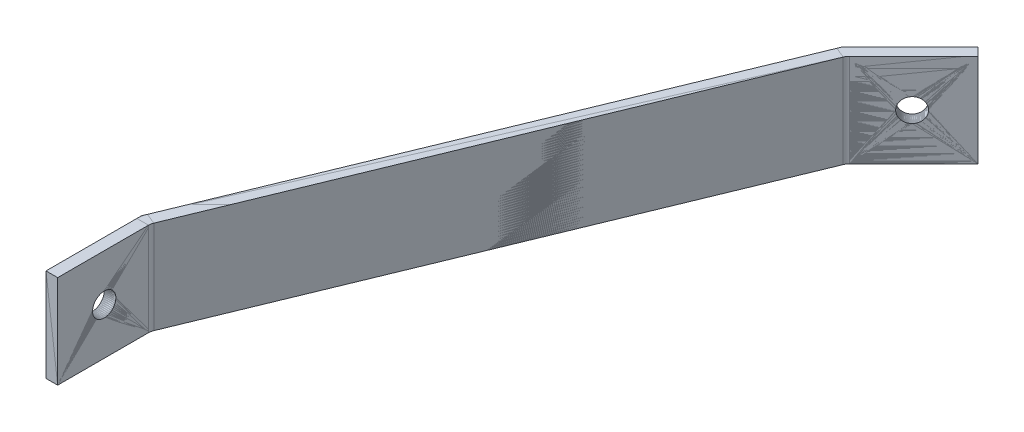
ISO-10303-21;
HEADER;
FILE_DESCRIPTION(('STEP AP214'),'2;1');
FILE_NAME('part.step','',(''),(''),'','','');
FILE_SCHEMA(('AUTOMOTIVE_DESIGN { 1 0 10303 214 1 1 1 1 }'));
ENDSEC;
DATA;
#1=APPLICATION_CONTEXT('core data for automotive mechanical design processes');
#2=APPLICATION_PROTOCOL_DEFINITION('international standard','automotive_design',2000,#1);
#3=PRODUCT_CONTEXT('',#1,'mechanical');
#4=PRODUCT('Part','Part','',(#3));
#5=PRODUCT_RELATED_PRODUCT_CATEGORY('part','',(#4));
#6=PRODUCT_DEFINITION_FORMATION('','',#4);
#7=PRODUCT_DEFINITION_CONTEXT('part definition',#1,'design');
#8=PRODUCT_DEFINITION('design','',#6,#7);
#9=PRODUCT_DEFINITION_SHAPE('','',#8);
#10=(LENGTH_UNIT() NAMED_UNIT(*) SI_UNIT(.MILLI.,.METRE.));
#11=(NAMED_UNIT(*) PLANE_ANGLE_UNIT() SI_UNIT($,.RADIAN.));
#12=(NAMED_UNIT(*) SI_UNIT($,.STERADIAN.) SOLID_ANGLE_UNIT());
#13=UNCERTAINTY_MEASURE_WITH_UNIT(LENGTH_MEASURE(1.E-05),#10,'distance_accuracy_value','');
#14=(GEOMETRIC_REPRESENTATION_CONTEXT(3) GLOBAL_UNCERTAINTY_ASSIGNED_CONTEXT((#13)) GLOBAL_UNIT_ASSIGNED_CONTEXT((#10,
#11,#12)) REPRESENTATION_CONTEXT('',''));
#15=CARTESIAN_POINT('',(0.,0.,0.));
#16=DIRECTION('',(0.,0.,1.));
#17=DIRECTION('',(1.,0.,0.));
#18=AXIS2_PLACEMENT_3D('',#15,#16,#17);
#19=CARTESIAN_POINT('',(63.6166951055954,851.804423501954,208.813328987844));
#20=DIRECTION('',(0.,1.,0.));
#21=DIRECTION('',(-0.380312673817329,0.,0.924857972952558));
#22=AXIS2_PLACEMENT_3D('',#19,#20,#21);
#23=PLANE('',#22);
#24=DIRECTION('',(0.924857972952558,0.,0.380312673817329));
#25=VECTOR('',#24,1.);
#26=CARTESIAN_POINT('',(8.60500466205431,851.804423501954,342.592726875448));
#27=LINE('',#26,#25);
#28=CARTESIAN_POINT('',(5.66858059792995,851.804423501954,341.385234136078));
#29=VERTEX_POINT('',#28);
#30=CARTESIAN_POINT('',(8.60500466205431,851.804423501954,342.592726875448));
#31=VERTEX_POINT('',#30);
#32=EDGE_CURVE('E12',#29,#31,#27,.T.);
#33=ORIENTED_EDGE('',*,*,#32,.F.);
#34=DIRECTION('',(0.380312673817329,0.,-0.924857972952558));
#35=VECTOR('',#34,1.);
#36=CARTESIAN_POINT('',(60.6802710414711,851.804423501954,207.605836248474));
#37=LINE('',#36,#35);
#38=CARTESIAN_POINT('',(60.4384756773761,851.804423501954,208.193842869609));
#39=VERTEX_POINT('',#38);
#40=EDGE_CURVE('E113',#39,#29,#37,.F.);
#41=ORIENTED_EDGE('',*,*,#40,.F.);
#42=DIRECTION('',(0.924857972952558,0.,0.380312673817328));
#43=VECTOR('',#42,1.);
#44=CARTESIAN_POINT('',(63.3748997415005,851.804423501954,209.40133560898));
#45=LINE('',#44,#43);
#46=CARTESIAN_POINT('',(63.3748997415005,851.804423501954,209.40133560898));
#47=VERTEX_POINT('',#46);
#48=EDGE_CURVE('E66',#39,#47,#45,.T.);
#49=ORIENTED_EDGE('',*,*,#48,.T.);
#50=DIRECTION('',(-0.380312673817329,0.,0.924857972952558));
#51=VECTOR('',#50,1.);
#52=CARTESIAN_POINT('',(63.6166951055954,851.804423501954,208.813328987844));
#53=LINE('',#52,#51);
#54=EDGE_CURVE('E115',#47,#31,#53,.T.);
#55=ORIENTED_EDGE('',*,*,#54,.T.);
#56=EDGE_LOOP('',(#33,#41,#49,#55));
#57=FACE_BOUND('',#56,.T.);
#58=ADVANCED_FACE('F55',(#57),#23,.F.);
#59=CARTESIAN_POINT('',(66.3113238056248,851.804423501954,210.60882834835));
#60=DIRECTION('',(0.,-1.,0.));
#61=DIRECTION('',(0.,0.,-1.));
#62=AXIS2_PLACEMENT_3D('',#59,#60,#61);
#63=PLANE('',#62);
#64=ORIENTED_EDGE('',*,*,#48,.F.);
#65=CARTESIAN_POINT('',(66.3113238056248,851.804423501954,210.60882834835));
#66=DIRECTION('',(0.,1.,0.));
#67=DIRECTION('',(0.,0.,1.));
#68=AXIS2_PLACEMENT_3D('',#65,#66,#67);
#69=CIRCLE('',#68,6.35);
#70=CARTESIAN_POINT('',(61.8211957450903,851.804423501954,206.118700287815));
#71=VERTEX_POINT('',#70);
#72=EDGE_CURVE('E160',#39,#71,#69,.F.);
#73=ORIENTED_EDGE('',*,*,#72,.T.);
#74=DIRECTION('',(0.707106781186548,0.,0.707106781186547));
#75=VECTOR('',#74,1.);
#76=CARTESIAN_POINT('',(64.0662597753575,851.804423501954,208.363764318082));
#77=LINE('',#76,#75);
#78=CARTESIAN_POINT('',(64.0662597753575,851.804423501954,208.363764318082));
#79=VERTEX_POINT('',#78);
#80=EDGE_CURVE('E199',#71,#79,#77,.T.);
#81=ORIENTED_EDGE('',*,*,#80,.T.);
#82=CARTESIAN_POINT('',(66.3113238056248,851.804423501954,210.60882834835));
#83=DIRECTION('',(0.,1.,0.));
#84=DIRECTION('',(0.,0.,1.));
#85=AXIS2_PLACEMENT_3D('',#82,#83,#84);
#86=CIRCLE('',#85,3.175);
#87=EDGE_CURVE('E269',#47,#79,#86,.F.);
#88=ORIENTED_EDGE('',*,*,#87,.F.);
#89=EDGE_LOOP('',(#64,#73,#81,#88));
#90=FACE_BOUND('',#89,.T.);
#91=ADVANCED_FACE('F314',(#90),#63,.T.);
#92=CARTESIAN_POINT('',(81.5772073477337,851.804423501954,190.852816745706));
#93=DIRECTION('',(0.,1.,0.));
#94=DIRECTION('',(-0.707106781186547,0.,0.707106781186548));
#95=AXIS2_PLACEMENT_3D('',#92,#93,#94);
#96=PLANE('',#95);
#97=ORIENTED_EDGE('',*,*,#80,.F.);
#98=DIRECTION('',(0.707106781186547,0.,-0.707106781186548));
#99=VECTOR('',#98,1.);
#100=CARTESIAN_POINT('',(79.3321433174664,851.804423501954,188.607752715439));
#101=LINE('',#100,#99);
#102=CARTESIAN_POINT('',(79.3321433174664,851.804423501954,188.607752715439));
#103=VERTEX_POINT('',#102);
#104=EDGE_CURVE('E167',#103,#71,#101,.F.);
#105=ORIENTED_EDGE('',*,*,#104,.F.);
#106=DIRECTION('',(0.707106781186548,0.,0.707106781186547));
#107=VECTOR('',#106,1.);
#108=CARTESIAN_POINT('',(81.5772073477337,851.804423501954,190.852816745706));
#109=LINE('',#108,#107);
#110=CARTESIAN_POINT('',(81.5772073477337,851.804423501954,190.852816745706));
#111=VERTEX_POINT('',#110);
#112=EDGE_CURVE('E195',#103,#111,#109,.T.);
#113=ORIENTED_EDGE('',*,*,#112,.T.);
#114=DIRECTION('',(-0.707106781186547,0.,0.707106781186548));
#115=VECTOR('',#114,1.);
#116=CARTESIAN_POINT('',(81.5772073477337,851.804423501954,190.852816745706));
#117=LINE('',#116,#115);
#118=EDGE_CURVE('E250',#111,#79,#117,.T.);
#119=ORIENTED_EDGE('',*,*,#118,.T.);
#120=EDGE_LOOP('',(#97,#105,#113,#119));
#121=FACE_BOUND('',#120,.T.);
#122=ADVANCED_FACE('F330',(#121),#96,.F.);
#123=CARTESIAN_POINT('',(81.5772073477337,877.204423501954,190.852816745706));
#124=DIRECTION('',(-0.707106781186547,0.,0.707106781186548));
#125=DIRECTION('',(0.,-1.,0.));
#126=AXIS2_PLACEMENT_3D('',#123,#124,#125);
#127=PLANE('',#126);
#128=ORIENTED_EDGE('',*,*,#112,.F.);
#129=DIRECTION('',(0.,1.,0.));
#130=VECTOR('',#129,1.);
#131=CARTESIAN_POINT('',(79.3321433174664,877.204423501954,188.607752715439));
#132=LINE('',#131,#130);
#133=CARTESIAN_POINT('',(79.3321433174664,877.204423501954,188.607752715439));
#134=VERTEX_POINT('',#133);
#135=EDGE_CURVE('E301',#134,#103,#132,.F.);
#136=ORIENTED_EDGE('',*,*,#135,.F.);
#137=DIRECTION('',(0.707106781186548,0.,0.707106781186547));
#138=VECTOR('',#137,1.);
#139=CARTESIAN_POINT('',(81.5772073477337,877.204423501954,190.852816745706));
#140=LINE('',#139,#138);
#141=CARTESIAN_POINT('',(81.5772073477337,877.204423501954,190.852816745706));
#142=VERTEX_POINT('',#141);
#143=EDGE_CURVE('E191',#134,#142,#140,.T.);
#144=ORIENTED_EDGE('',*,*,#143,.T.);
#145=DIRECTION('',(0.,-1.,0.));
#146=VECTOR('',#145,1.);
#147=CARTESIAN_POINT('',(81.5772073477337,877.204423501954,190.852816745706));
#148=LINE('',#147,#146);
#149=EDGE_CURVE('E246',#142,#111,#148,.T.);
#150=ORIENTED_EDGE('',*,*,#149,.T.);
#151=EDGE_LOOP('',(#128,#136,#144,#150));
#152=FACE_BOUND('',#151,.T.);
#153=ADVANCED_FACE('F325',(#152),#127,.F.);
#154=CARTESIAN_POINT('',(81.5772073477337,877.204423501954,190.852816745706));
#155=DIRECTION('',(0.,1.,0.));
#156=DIRECTION('',(-0.707106781186547,0.,0.707106781186548));
#157=AXIS2_PLACEMENT_3D('',#154,#155,#156);
#158=PLANE('',#157);
#159=ORIENTED_EDGE('',*,*,#143,.F.);
#160=DIRECTION('',(0.707106781186547,0.,-0.707106781186548));
#161=VECTOR('',#160,1.);
#162=CARTESIAN_POINT('',(79.3321433174664,877.204423501954,188.607752715439));
#163=LINE('',#162,#161);
#164=CARTESIAN_POINT('',(61.8211957450903,877.204423501954,206.118700287815));
#165=VERTEX_POINT('',#164);
#166=EDGE_CURVE('E146',#134,#165,#163,.F.);
#167=ORIENTED_EDGE('',*,*,#166,.T.);
#168=DIRECTION('',(0.70710678118655,0.,0.707106781186545));
#169=VECTOR('',#168,1.);
#170=CARTESIAN_POINT('',(64.0662597753575,877.204423501954,208.363764318082));
#171=LINE('',#170,#169);
#172=CARTESIAN_POINT('',(64.0662597753575,877.204423501954,208.363764318082));
#173=VERTEX_POINT('',#172);
#174=EDGE_CURVE('E187',#165,#173,#171,.T.);
#175=ORIENTED_EDGE('',*,*,#174,.T.);
#176=DIRECTION('',(-0.707106781186547,0.,0.707106781186548));
#177=VECTOR('',#176,1.);
#178=CARTESIAN_POINT('',(81.5772073477337,877.204423501954,190.852816745706));
#179=LINE('',#178,#177);
#180=EDGE_CURVE('E242',#142,#173,#179,.T.);
#181=ORIENTED_EDGE('',*,*,#180,.F.);
#182=EDGE_LOOP('',(#159,#167,#175,#181));
#183=FACE_BOUND('',#182,.T.);
#184=ADVANCED_FACE('F430',(#183),#158,.T.);
#185=CARTESIAN_POINT('',(66.3113238056248,877.204423501954,210.60882834835));
#186=DIRECTION('',(0.,1.,0.));
#187=DIRECTION('',(0.,0.,1.));
#188=AXIS2_PLACEMENT_3D('',#185,#186,#187);
#189=PLANE('',#188);
#190=ORIENTED_EDGE('',*,*,#174,.F.);
#191=CARTESIAN_POINT('',(66.3113238056248,877.204423501954,210.60882834835));
#192=DIRECTION('',(0.,1.,0.));
#193=DIRECTION('',(0.,0.,1.));
#194=AXIS2_PLACEMENT_3D('',#191,#192,#193);
#195=CIRCLE('',#194,6.35);
#196=CARTESIAN_POINT('',(60.4384756773761,877.204423501954,208.193842869609));
#197=VERTEX_POINT('',#196);
#198=EDGE_CURVE('E153',#165,#197,#195,.T.);
#199=ORIENTED_EDGE('',*,*,#198,.T.);
#200=DIRECTION('',(0.924857972952558,0.,0.380312673817329));
#201=VECTOR('',#200,1.);
#202=CARTESIAN_POINT('',(63.3748997415005,877.204423501954,209.40133560898));
#203=LINE('',#202,#201);
#204=CARTESIAN_POINT('',(63.3748997415005,877.204423501954,209.40133560898));
#205=VERTEX_POINT('',#204);
#206=EDGE_CURVE('E184',#197,#205,#203,.T.);
#207=ORIENTED_EDGE('',*,*,#206,.T.);
#208=CARTESIAN_POINT('',(66.3113238056248,877.204423501954,210.60882834835));
#209=DIRECTION('',(0.,-1.,0.));
#210=DIRECTION('',(0.,0.,-1.));
#211=AXIS2_PLACEMENT_3D('',#208,#209,#210);
#212=CIRCLE('',#211,3.175);
#213=EDGE_CURVE('E265',#173,#205,#212,.F.);
#214=ORIENTED_EDGE('',*,*,#213,.F.);
#215=EDGE_LOOP('',(#190,#199,#207,#214));
#216=FACE_BOUND('',#215,.T.);
#217=ADVANCED_FACE('F426',(#216),#189,.T.);
#218=CARTESIAN_POINT('',(63.6166951055954,877.204423501954,208.813328987844));
#219=DIRECTION('',(0.,1.,0.));
#220=DIRECTION('',(-0.380312673817329,0.,0.924857972952558));
#221=AXIS2_PLACEMENT_3D('',#218,#219,#220);
#222=PLANE('',#221);
#223=ORIENTED_EDGE('',*,*,#206,.F.);
#224=DIRECTION('',(0.380312673817329,0.,-0.924857972952558));
#225=VECTOR('',#224,1.);
#226=CARTESIAN_POINT('',(60.6802710414711,877.204423501954,207.605836248474));
#227=LINE('',#226,#225);
#228=CARTESIAN_POINT('',(5.66858059792993,877.204423501954,341.385234136078));
#229=VERTEX_POINT('',#228);
#230=EDGE_CURVE('E145',#197,#229,#227,.F.);
#231=ORIENTED_EDGE('',*,*,#230,.T.);
#232=DIRECTION('',(0.924857972952555,0.,0.380312673817336));
#233=VECTOR('',#232,1.);
#234=CARTESIAN_POINT('',(8.60500466205431,877.204423501954,342.592726875448));
#235=LINE('',#234,#233);
#236=CARTESIAN_POINT('',(8.60500466205431,877.204423501954,342.592726875448));
#237=VERTEX_POINT('',#236);
#238=EDGE_CURVE('E180',#229,#237,#235,.T.);
#239=ORIENTED_EDGE('',*,*,#238,.T.);
#240=DIRECTION('',(-0.380312673817329,0.,0.924857972952558));
#241=VECTOR('',#240,1.);
#242=CARTESIAN_POINT('',(63.6166951055954,877.204423501954,208.813328987844));
#243=LINE('',#242,#241);
#244=EDGE_CURVE('E236',#205,#237,#243,.T.);
#245=ORIENTED_EDGE('',*,*,#244,.F.);
#246=EDGE_LOOP('',(#223,#231,#239,#245));
#247=FACE_BOUND('',#246,.T.);
#248=ADVANCED_FACE('F423',(#247),#222,.T.);
#249=CARTESIAN_POINT('',(11.5414287261787,877.204423501954,343.800219614818));
#250=DIRECTION('',(0.,1.,0.));
#251=DIRECTION('',(0.,0.,1.));
#252=AXIS2_PLACEMENT_3D('',#249,#250,#251);
#253=PLANE('',#252);
#254=ORIENTED_EDGE('',*,*,#238,.F.);
#255=CARTESIAN_POINT('',(11.5414287261787,877.204423501954,343.800219614818));
#256=DIRECTION('',(0.,1.,0.));
#257=DIRECTION('',(0.,0.,1.));
#258=AXIS2_PLACEMENT_3D('',#255,#256,#257);
#259=CIRCLE('',#258,6.35);
#260=CARTESIAN_POINT('',(5.19142872617868,877.204423501954,343.800219614818));
#261=VERTEX_POINT('',#260);
#262=EDGE_CURVE('E131',#229,#261,#259,.T.);
#263=ORIENTED_EDGE('',*,*,#262,.T.);
#264=DIRECTION('',(1.,0.,0.));
#265=VECTOR('',#264,1.);
#266=CARTESIAN_POINT('',(8.36642872617868,877.204423501954,343.800219614818));
#267=LINE('',#266,#265);
#268=CARTESIAN_POINT('',(8.36642872617868,877.204423501954,343.800219614818));
#269=VERTEX_POINT('',#268);
#270=EDGE_CURVE('E176',#261,#269,#267,.T.);
#271=ORIENTED_EDGE('',*,*,#270,.T.);
#272=CARTESIAN_POINT('',(11.5414287261787,877.204423501954,343.800219614818));
#273=DIRECTION('',(0.,-1.,0.));
#274=DIRECTION('',(0.,0.,-1.));
#275=AXIS2_PLACEMENT_3D('',#272,#273,#274);
#276=CIRCLE('',#275,3.175);
#277=EDGE_CURVE('E258',#237,#269,#276,.F.);
#278=ORIENTED_EDGE('',*,*,#277,.F.);
#279=EDGE_LOOP('',(#254,#263,#271,#278));
#280=FACE_BOUND('',#279,.T.);
#281=ADVANCED_FACE('F373',(#280),#253,.T.);
#282=CARTESIAN_POINT('',(8.36642872617868,877.204423501954,343.172904375805));
#283=DIRECTION('',(0.,1.,0.));
#284=DIRECTION('',(0.,0.,1.));
#285=AXIS2_PLACEMENT_3D('',#282,#283,#284);
#286=PLANE('',#285);
#287=ORIENTED_EDGE('',*,*,#270,.F.);
#288=DIRECTION('',(0.,0.,-1.));
#289=VECTOR('',#288,1.);
#290=CARTESIAN_POINT('',(5.19142872617868,877.204423501954,343.172904375805));
#291=LINE('',#290,#289);
#292=CARTESIAN_POINT('',(5.19142872617868,877.204423501954,368.572904375805));
#293=VERTEX_POINT('',#292);
#294=EDGE_CURVE('E284',#261,#293,#291,.F.);
#295=ORIENTED_EDGE('',*,*,#294,.T.);
#296=DIRECTION('',(1.,0.,0.));
#297=VECTOR('',#296,1.);
#298=CARTESIAN_POINT('',(8.36642872617868,877.204423501954,368.572904375805));
#299=LINE('',#298,#297);
#300=CARTESIAN_POINT('',(8.36642872617868,877.204423501954,368.572904375805));
#301=VERTEX_POINT('',#300);
#302=EDGE_CURVE('E172',#293,#301,#299,.T.);
#303=ORIENTED_EDGE('',*,*,#302,.T.);
#304=DIRECTION('',(0.,0.,1.));
#305=VECTOR('',#304,1.);
#306=CARTESIAN_POINT('',(8.36642872617868,877.204423501954,343.172904375805));
#307=LINE('',#306,#305);
#308=EDGE_CURVE('E224',#269,#301,#307,.T.);
#309=ORIENTED_EDGE('',*,*,#308,.F.);
#310=EDGE_LOOP('',(#287,#295,#303,#309));
#311=FACE_BOUND('',#310,.T.);
#312=ADVANCED_FACE('F356',(#311),#286,.T.);
#313=CARTESIAN_POINT('',(8.36642872617868,877.204423501954,368.572904375805));
#314=DIRECTION('',(0.,0.,1.));
#315=DIRECTION('',(0.,-1.,0.));
#316=AXIS2_PLACEMENT_3D('',#313,#314,#315);
#317=PLANE('',#316);
#318=ORIENTED_EDGE('',*,*,#302,.F.);
#319=DIRECTION('',(0.,1.,0.));
#320=VECTOR('',#319,1.);
#321=CARTESIAN_POINT('',(5.19142872617868,877.204423501954,368.572904375805));
#322=LINE('',#321,#320);
#323=CARTESIAN_POINT('',(5.19142872617868,851.804423501954,368.572904375805));
#324=VERTEX_POINT('',#323);
#325=EDGE_CURVE('E137',#293,#324,#322,.F.);
#326=ORIENTED_EDGE('',*,*,#325,.T.);
#327=DIRECTION('',(1.,0.,0.));
#328=VECTOR('',#327,1.);
#329=CARTESIAN_POINT('',(8.36642872617868,851.804423501954,368.572904375805));
#330=LINE('',#329,#328);
#331=CARTESIAN_POINT('',(8.36642872617868,851.804423501954,368.572904375805));
#332=VERTEX_POINT('',#331);
#333=EDGE_CURVE('E168',#324,#332,#330,.T.);
#334=ORIENTED_EDGE('',*,*,#333,.T.);
#335=DIRECTION('',(0.,-1.,0.));
#336=VECTOR('',#335,1.);
#337=CARTESIAN_POINT('',(8.36642872617868,877.204423501954,368.572904375805));
#338=LINE('',#337,#336);
#339=EDGE_CURVE('E220',#301,#332,#338,.T.);
#340=ORIENTED_EDGE('',*,*,#339,.F.);
#341=EDGE_LOOP('',(#318,#326,#334,#340));
#342=FACE_BOUND('',#341,.T.);
#343=ADVANCED_FACE('F365',(#342),#317,.T.);
#344=CARTESIAN_POINT('',(8.36642872617868,851.804423501954,343.172904375805));
#345=DIRECTION('',(0.,1.,0.));
#346=DIRECTION('',(0.,0.,1.));
#347=AXIS2_PLACEMENT_3D('',#344,#345,#346);
#348=PLANE('',#347);
#349=ORIENTED_EDGE('',*,*,#333,.F.);
#350=DIRECTION('',(0.,0.,-1.));
#351=VECTOR('',#350,1.);
#352=CARTESIAN_POINT('',(5.19142872617868,851.804423501954,343.172904375805));
#353=LINE('',#352,#351);
#354=CARTESIAN_POINT('',(5.19142872617868,851.804423501954,343.800219614818));
#355=VERTEX_POINT('',#354);
#356=EDGE_CURVE('E288',#355,#324,#353,.F.);
#357=ORIENTED_EDGE('',*,*,#356,.F.);
#358=DIRECTION('',(1.,0.,0.));
#359=VECTOR('',#358,1.);
#360=CARTESIAN_POINT('',(8.36642872617868,851.804423501954,343.800219614818));
#361=LINE('',#360,#359);
#362=CARTESIAN_POINT('',(8.36642872617868,851.804423501954,343.800219614818));
#363=VERTEX_POINT('',#362);
#364=EDGE_CURVE('E59',#355,#363,#361,.T.);
#365=ORIENTED_EDGE('',*,*,#364,.T.);
#366=DIRECTION('',(0.,0.,1.));
#367=VECTOR('',#366,1.);
#368=CARTESIAN_POINT('',(8.36642872617868,851.804423501954,343.172904375805));
#369=LINE('',#368,#367);
#370=EDGE_CURVE('E228',#363,#332,#369,.T.);
#371=ORIENTED_EDGE('',*,*,#370,.T.);
#372=EDGE_LOOP('',(#349,#357,#365,#371));
#373=FACE_BOUND('',#372,.T.);
#374=ADVANCED_FACE('F367',(#373),#348,.F.);
#375=CARTESIAN_POINT('',(72.5969512266646,864.504423501954,199.833072866775));
#376=DIRECTION('',(0.707106781186548,0.,0.707106781186547));
#377=DIRECTION('',(0.707106781186547,0.,-0.707106781186548));
#378=AXIS2_PLACEMENT_3D('',#375,#376,#377);
#379=CYLINDRICAL_SURFACE('',#378,3.17499999999998);
#380=CARTESIAN_POINT('',(72.5969512266646,864.504423501954,199.833072866775));
#381=DIRECTION('',(0.707106781186548,0.,0.707106781186547));
#382=DIRECTION('',(0.707106781186547,0.,-0.707106781186548));
#383=AXIS2_PLACEMENT_3D('',#380,#381,#382);
#384=CIRCLE('',#383,3.17499999999998);
#385=CARTESIAN_POINT('',(74.8420152569319,864.504423501954,197.588008836508));
#386=VERTEX_POINT('',#385);
#387=EDGE_CURVE('E254',#386,#386,#384,.T.);
#388=CARTESIAN_POINT('',(70.3518871963973,864.504423501954,197.588008836508));
#389=DIRECTION('',(0.707106781186548,0.,0.707106781186547));
#390=DIRECTION('',(0.707106781186547,0.,-0.707106781186548));
#391=AXIS2_PLACEMENT_3D('',#388,#389,#390);
#392=CIRCLE('',#391,3.17499999999998);
#393=CARTESIAN_POINT('',(72.5969512266646,864.504423501954,195.342944806241));
#394=VERTEX_POINT('',#393);
#395=EDGE_CURVE('E157',#394,#394,#392,.T.);
#396=CARTESIAN_POINT('',(74.8420152569319,864.504423501954,197.588008836508));
#397=CARTESIAN_POINT('',(74.8186291732833,864.504423501954,197.564622752859));
#398=CARTESIAN_POINT('',(74.7952430896347,864.504423501954,197.541236669211));
#399=CARTESIAN_POINT('',(74.7484709223374,864.504423501954,197.494464501913));
#400=CARTESIAN_POINT('',(74.7250848386888,864.504423501954,197.471078418265));
#401=CARTESIAN_POINT('',(74.6783126713916,864.504423501954,197.424306250968));
#402=CARTESIAN_POINT('',(74.6549265877429,864.504423501954,197.400920167319));
#403=CARTESIAN_POINT('',(74.6081544204457,864.504423501954,197.354148000022));
#404=CARTESIAN_POINT('',(74.5847683367971,864.504423501954,197.330761916373));
#405=CARTESIAN_POINT('',(74.5379961694999,864.504423501954,197.283989749076));
#406=CARTESIAN_POINT('',(74.5146100858512,864.504423501954,197.260603665427));
#407=CARTESIAN_POINT('',(74.467837918554,864.504423501954,197.21383149813));
#408=CARTESIAN_POINT('',(74.4444518349054,864.504423501954,197.190445414481));
#409=CARTESIAN_POINT('',(74.3976796676082,864.504423501954,197.143673247184));
#410=CARTESIAN_POINT('',(74.3742935839595,864.504423501954,197.120287163535));
#411=CARTESIAN_POINT('',(74.3275214166623,864.504423501954,197.073514996238));
#412=CARTESIAN_POINT('',(74.3041353330137,864.504423501954,197.05012891259));
#413=CARTESIAN_POINT('',(74.2573631657165,864.504423501954,197.003356745292));
#414=CARTESIAN_POINT('',(74.2339770820678,864.504423501954,196.979970661644));
#415=CARTESIAN_POINT('',(74.1872049147706,864.504423501954,196.933198494347));
#416=CARTESIAN_POINT('',(74.163818831122,864.504423501954,196.909812410698));
#417=CARTESIAN_POINT('',(74.1170466638248,864.504423501954,196.863040243401));
#418=CARTESIAN_POINT('',(74.0936605801761,864.504423501954,196.839654159752));
#419=CARTESIAN_POINT('',(74.0468884128789,864.504423501954,196.792881992455));
#420=CARTESIAN_POINT('',(74.0235023292303,864.504423501954,196.769495908806));
#421=CARTESIAN_POINT('',(73.976730161933,864.504423501954,196.722723741509));
#422=CARTESIAN_POINT('',(73.9533440782844,864.504423501954,196.69933765786));
#423=CARTESIAN_POINT('',(73.9065719109872,864.504423501954,196.652565490563));
#424=CARTESIAN_POINT('',(73.8831858273386,864.504423501954,196.629179406914));
#425=CARTESIAN_POINT('',(73.8364136600413,864.504423501954,196.582407239617));
#426=CARTESIAN_POINT('',(73.8130275763927,864.504423501954,196.559021155969));
#427=CARTESIAN_POINT('',(73.7662554090955,864.504423501954,196.512248988671));
#428=CARTESIAN_POINT('',(73.7428693254469,864.504423501954,196.488862905023));
#429=CARTESIAN_POINT('',(73.6960971581496,864.504423501954,196.442090737726));
#430=CARTESIAN_POINT('',(73.672711074501,864.504423501954,196.418704654077));
#431=CARTESIAN_POINT('',(73.6259389072038,864.504423501954,196.37193248678));
#432=CARTESIAN_POINT('',(73.6025528235552,864.504423501954,196.348546403131));
#433=CARTESIAN_POINT('',(73.5557806562579,864.504423501954,196.301774235834));
#434=CARTESIAN_POINT('',(73.5323945726093,864.504423501954,196.278388152185));
#435=CARTESIAN_POINT('',(73.4856224053121,864.504423501954,196.231615984888));
#436=CARTESIAN_POINT('',(73.4622363216635,864.504423501954,196.208229901239));
#437=CARTESIAN_POINT('',(73.4154641543662,864.504423501954,196.161457733942));
#438=CARTESIAN_POINT('',(73.3920780707176,864.504423501954,196.138071650294));
#439=CARTESIAN_POINT('',(73.3453059034204,864.504423501954,196.091299482996));
#440=CARTESIAN_POINT('',(73.3219198197718,864.504423501954,196.067913399348));
#441=CARTESIAN_POINT('',(73.2751476524745,864.504423501954,196.02114123205));
#442=CARTESIAN_POINT('',(73.2517615688259,864.504423501954,195.997755148402));
#443=CARTESIAN_POINT('',(73.2049894015287,864.504423501954,195.950982981105));
#444=CARTESIAN_POINT('',(73.18160331788,864.504423501954,195.927596897456));
#445=CARTESIAN_POINT('',(73.1348311505828,864.504423501954,195.880824730159));
#446=CARTESIAN_POINT('',(73.1114450669342,864.504423501954,195.85743864651));
#447=CARTESIAN_POINT('',(73.064672899637,864.504423501954,195.810666479213));
#448=CARTESIAN_POINT('',(73.0412868159883,864.504423501954,195.787280395564));
#449=CARTESIAN_POINT('',(72.9945146486911,864.504423501954,195.740508228267));
#450=CARTESIAN_POINT('',(72.9711285650425,864.504423501954,195.717122144618));
#451=CARTESIAN_POINT('',(72.9243563977452,864.504423501954,195.670349977321));
#452=CARTESIAN_POINT('',(72.9009703140966,864.504423501954,195.646963893673));
#453=CARTESIAN_POINT('',(72.8541981467994,864.504423501954,195.600191726375));
#454=CARTESIAN_POINT('',(72.8308120631508,864.504423501954,195.576805642727));
#455=CARTESIAN_POINT('',(72.7840398958535,864.504423501954,195.530033475429));
#456=CARTESIAN_POINT('',(72.7606538122049,864.504423501954,195.506647391781));
#457=CARTESIAN_POINT('',(72.7138816449077,864.504423501954,195.459875224484));
#458=CARTESIAN_POINT('',(72.6904955612591,864.504423501954,195.436489140835));
#459=CARTESIAN_POINT('',(72.6437233939618,864.504423501954,195.389716973538));
#460=CARTESIAN_POINT('',(72.6203373103132,864.504423501954,195.366330889889));
#461=CARTESIAN_POINT('',(72.5969512266646,864.504423501954,195.342944806241));
#462=B_SPLINE_CURVE_WITH_KNOTS('',3,(#396,#397,#398,#399,#400,#401,#402,#403,#404,#405,#406,
#407,#408,#409,#410,#411,#412,#413,#414,#415,#416,#417,#418,#419,#420,#421,#422,#423,#424,#425,
#426,#427,#428,#429,#430,#431,#432,#433,#434,#435,#436,#437,#438,#439,#440,#441,#442,#443,#444,
#445,#446,#447,#448,#449,#450,#451,#452,#453,#454,#455,#456,#457,#458,#459,#460,#461),
.UNSPECIFIED.,.F.,.F.,(4,2,2,2,2,2,2,2,2,2,2,2,2,2,2,2,2,2,2,2,2,2,2,2,2,2,2,2,2,2,2,2,4),(0.,
0.0992187500000131,0.198437500000016,0.29765625000001,0.396875000000013,0.496093750000016,
0.59531250000001,0.694531250000013,0.793750000000017,0.89296875000001,0.992187500000013,
1.09140625000002,1.19062500000001,1.28984375000001,1.38906250000002,1.48828125000001,
1.58750000000001,1.68671875000002,1.78593750000001,1.88515625000001,1.98437500000002,
2.08359375000001,2.18281250000001,2.28203125000002,2.38125000000001,2.48046875000001,
2.57968750000002,2.67890625000001,2.77812500000001,2.87734375,2.97656250000001,3.07578125000001,
3.175),.UNSPECIFIED.);
#463=EDGE_CURVE('BSEAM57',#386,#394,#462,.T.);
#464=ORIENTED_EDGE('',*,*,#387,.T.);
#465=ORIENTED_EDGE('',*,*,#395,.F.);
#466=ORIENTED_EDGE('',*,*,#463,.T.);
#467=ORIENTED_EDGE('',*,*,#463,.F.);
#468=EDGE_LOOP('',(#464,#466,#465,#467));
#469=FACE_BOUND('',#468,.T.);
#470=ADVANCED_FACE('F57',(#469),#379,.F.);
#471=CARTESIAN_POINT('',(8.36642872617868,864.504423501954,355.872904375805));
#472=DIRECTION('',(1.,0.,0.));
#473=DIRECTION('',(0.,0.,-1.));
#474=AXIS2_PLACEMENT_3D('',#471,#472,#473);
#475=CYLINDRICAL_SURFACE('',#474,3.17499999999997);
#476=CARTESIAN_POINT('',(8.36642872617868,864.504423501954,355.872904375805));
#477=DIRECTION('',(1.,0.,0.));
#478=DIRECTION('',(0.,0.,-1.));
#479=AXIS2_PLACEMENT_3D('',#476,#477,#478);
#480=CIRCLE('',#479,3.17499999999997);
#481=CARTESIAN_POINT('',(8.36642872617868,864.504423501954,352.697904375805));
#482=VERTEX_POINT('',#481);
#483=EDGE_CURVE('E232',#482,#482,#480,.T.);
#484=ORIENTED_EDGE('',*,*,#483,.T.);
#485=EDGE_LOOP('',(#484));
#486=FACE_BOUND('',#485,.T.);
#487=CARTESIAN_POINT('',(5.19142872617868,864.504423501954,355.872904375805));
#488=DIRECTION('',(1.,0.,0.));
#489=DIRECTION('',(0.,0.,-1.));
#490=AXIS2_PLACEMENT_3D('',#487,#488,#489);
#491=CIRCLE('',#490,3.17499999999997);
#492=CARTESIAN_POINT('',(5.19142872617868,864.504423501954,352.697904375805));
#493=VERTEX_POINT('',#492);
#494=EDGE_CURVE('E292',#493,#493,#491,.T.);
#495=ORIENTED_EDGE('',*,*,#494,.F.);
#496=EDGE_LOOP('',(#495));
#497=FACE_BOUND('',#496,.T.);
#498=ADVANCED_FACE('F396',(#486,#497),#475,.F.);
#499=CARTESIAN_POINT('',(11.5414287261787,851.804423501954,343.800219614818));
#500=DIRECTION('',(0.,-1.,0.));
#501=DIRECTION('',(0.,0.,-1.));
#502=AXIS2_PLACEMENT_3D('',#499,#500,#501);
#503=PLANE('',#502);
#504=CARTESIAN_POINT('',(11.5414287261787,851.804423501954,343.800219614818));
#505=DIRECTION('',(0.,1.,0.));
#506=DIRECTION('',(0.,0.,1.));
#507=AXIS2_PLACEMENT_3D('',#504,#505,#506);
#508=CIRCLE('',#507,6.35);
#509=EDGE_CURVE('E128',#355,#29,#508,.F.);
#510=ORIENTED_EDGE('',*,*,#509,.T.);
#511=ORIENTED_EDGE('',*,*,#32,.T.);
#512=CARTESIAN_POINT('',(11.5414287261787,851.804423501954,343.800219614818));
#513=DIRECTION('',(0.,1.,0.));
#514=DIRECTION('',(0.,0.,1.));
#515=AXIS2_PLACEMENT_3D('',#512,#513,#514);
#516=CIRCLE('',#515,3.175);
#517=EDGE_CURVE('E262',#363,#31,#516,.F.);
#518=ORIENTED_EDGE('',*,*,#517,.F.);
#519=ORIENTED_EDGE('',*,*,#364,.F.);
#520=EDGE_LOOP('',(#510,#511,#518,#519));
#521=FACE_BOUND('',#520,.T.);
#522=ADVANCED_FACE('F149',(#521),#503,.T.);
#523=CARTESIAN_POINT('',(8.36642872617868,877.204423501954,343.172904375805));
#524=DIRECTION('',(1.,0.,0.));
#525=DIRECTION('',(0.,0.,-1.));
#526=AXIS2_PLACEMENT_3D('',#523,#524,#525);
#527=PLANE('',#526);
#528=ORIENTED_EDGE('',*,*,#483,.F.);
#529=EDGE_LOOP('',(#528));
#530=FACE_BOUND('',#529,.T.);
#531=ORIENTED_EDGE('',*,*,#370,.F.);
#532=DIRECTION('',(0.,-1.,0.));
#533=VECTOR('',#532,1.);
#534=CARTESIAN_POINT('',(8.36642872617868,877.204423501954,343.800219614818));
#535=LINE('',#534,#533);
#536=EDGE_CURVE('E213',#363,#269,#535,.F.);
#537=ORIENTED_EDGE('',*,*,#536,.T.);
#538=ORIENTED_EDGE('',*,*,#308,.T.);
#539=ORIENTED_EDGE('',*,*,#339,.T.);
#540=EDGE_LOOP('',(#531,#537,#538,#539));
#541=FACE_BOUND('',#540,.T.);
#542=ADVANCED_FACE('F363',(#530,#541),#527,.T.);
#543=CARTESIAN_POINT('',(63.6166951055954,877.204423501954,208.813328987844));
#544=DIRECTION('',(0.924857972952558,0.,0.380312673817329));
#545=DIRECTION('',(0.380312673817329,0.,-0.924857972952558));
#546=AXIS2_PLACEMENT_3D('',#543,#544,#545);
#547=PLANE('',#546);
#548=ORIENTED_EDGE('',*,*,#54,.F.);
#549=DIRECTION('',(0.,-1.,0.));
#550=VECTOR('',#549,1.);
#551=CARTESIAN_POINT('',(63.3748997415005,877.204423501954,209.40133560898));
#552=LINE('',#551,#550);
#553=EDGE_CURVE('E206',#47,#205,#552,.F.);
#554=ORIENTED_EDGE('',*,*,#553,.T.);
#555=ORIENTED_EDGE('',*,*,#244,.T.);
#556=DIRECTION('',(0.,-1.,0.));
#557=VECTOR('',#556,1.);
#558=CARTESIAN_POINT('',(8.60500466205431,851.804423501954,342.592726875448));
#559=LINE('',#558,#557);
#560=EDGE_CURVE('E217',#237,#31,#559,.T.);
#561=ORIENTED_EDGE('',*,*,#560,.T.);
#562=EDGE_LOOP('',(#548,#554,#555,#561));
#563=FACE_BOUND('',#562,.T.);
#564=ADVANCED_FACE('F402',(#563),#547,.T.);
#565=CARTESIAN_POINT('',(81.5772073477337,877.204423501954,190.852816745706));
#566=DIRECTION('',(0.707106781186548,0.,0.707106781186547));
#567=DIRECTION('',(0.707106781186547,0.,-0.707106781186548));
#568=AXIS2_PLACEMENT_3D('',#565,#566,#567);
#569=PLANE('',#568);
#570=ORIENTED_EDGE('',*,*,#387,.F.);
#571=EDGE_LOOP('',(#570));
#572=FACE_BOUND('',#571,.T.);
#573=ORIENTED_EDGE('',*,*,#180,.T.);
#574=DIRECTION('',(0.,-1.,0.));
#575=VECTOR('',#574,1.);
#576=CARTESIAN_POINT('',(64.0662597753575,851.804423501954,208.363764318082));
#577=LINE('',#576,#575);
#578=EDGE_CURVE('E209',#173,#79,#577,.T.);
#579=ORIENTED_EDGE('',*,*,#578,.T.);
#580=ORIENTED_EDGE('',*,*,#118,.F.);
#581=ORIENTED_EDGE('',*,*,#149,.F.);
#582=EDGE_LOOP('',(#573,#579,#580,#581));
#583=FACE_BOUND('',#582,.T.);
#584=ADVANCED_FACE('F333',(#572,#583),#569,.T.);
#585=CARTESIAN_POINT('',(11.5414287261787,877.204423501954,343.800219614818));
#586=DIRECTION('',(0.,1.,0.));
#587=DIRECTION('',(0.,0.,1.));
#588=AXIS2_PLACEMENT_3D('',#585,#586,#587);
#589=CYLINDRICAL_SURFACE('',#588,3.175);
#590=ORIENTED_EDGE('',*,*,#277,.T.);
#591=ORIENTED_EDGE('',*,*,#536,.F.);
#592=ORIENTED_EDGE('',*,*,#517,.T.);
#593=ORIENTED_EDGE('',*,*,#560,.F.);
#594=EDGE_LOOP('',(#590,#591,#592,#593));
#595=FACE_BOUND('',#594,.T.);
#596=ADVANCED_FACE('F370',(#595),#589,.F.);
#597=CARTESIAN_POINT('',(66.3113238056248,877.204423501954,210.60882834835));
#598=DIRECTION('',(0.,1.,0.));
#599=DIRECTION('',(0.,0.,1.));
#600=AXIS2_PLACEMENT_3D('',#597,#598,#599);
#601=CYLINDRICAL_SURFACE('',#600,3.175);
#602=ORIENTED_EDGE('',*,*,#213,.T.);
#603=ORIENTED_EDGE('',*,*,#553,.F.);
#604=ORIENTED_EDGE('',*,*,#87,.T.);
#605=ORIENTED_EDGE('',*,*,#578,.F.);
#606=EDGE_LOOP('',(#602,#603,#604,#605));
#607=FACE_BOUND('',#606,.T.);
#608=ADVANCED_FACE('F340',(#607),#601,.F.);
#609=CARTESIAN_POINT('',(5.19142872617868,877.204423501954,343.172904375805));
#610=DIRECTION('',(1.,0.,0.));
#611=DIRECTION('',(0.,0.,-1.));
#612=AXIS2_PLACEMENT_3D('',#609,#610,#611);
#613=PLANE('',#612);
#614=ORIENTED_EDGE('',*,*,#494,.T.);
#615=EDGE_LOOP('',(#614));
#616=FACE_BOUND('',#615,.T.);
#617=ORIENTED_EDGE('',*,*,#356,.T.);
#618=ORIENTED_EDGE('',*,*,#325,.F.);
#619=ORIENTED_EDGE('',*,*,#294,.F.);
#620=DIRECTION('',(0.,1.,0.));
#621=VECTOR('',#620,1.);
#622=CARTESIAN_POINT('',(5.19142872617868,877.204423501954,343.800219614818));
#623=LINE('',#622,#621);
#624=EDGE_CURVE('E136',#355,#261,#623,.T.);
#625=ORIENTED_EDGE('',*,*,#624,.F.);
#626=EDGE_LOOP('',(#617,#618,#619,#625));
#627=FACE_BOUND('',#626,.T.);
#628=ADVANCED_FACE('F375',(#616,#627),#613,.F.);
#629=CARTESIAN_POINT('',(60.6802710414711,877.204423501954,207.605836248474));
#630=DIRECTION('',(0.924857972952558,0.,0.380312673817329));
#631=DIRECTION('',(0.380312673817329,0.,-0.924857972952558));
#632=AXIS2_PLACEMENT_3D('',#629,#630,#631);
#633=PLANE('',#632);
#634=ORIENTED_EDGE('',*,*,#40,.T.);
#635=DIRECTION('',(0.,1.,0.));
#636=VECTOR('',#635,1.);
#637=CARTESIAN_POINT('',(5.66858059792993,877.204423501954,341.385234136078));
#638=LINE('',#637,#636);
#639=EDGE_CURVE('E125',#229,#29,#638,.F.);
#640=ORIENTED_EDGE('',*,*,#639,.F.);
#641=ORIENTED_EDGE('',*,*,#230,.F.);
#642=DIRECTION('',(0.,1.,0.));
#643=VECTOR('',#642,1.);
#644=CARTESIAN_POINT('',(60.4384756773761,877.204423501954,208.193842869609));
#645=LINE('',#644,#643);
#646=EDGE_CURVE('E142',#39,#197,#645,.T.);
#647=ORIENTED_EDGE('',*,*,#646,.F.);
#648=EDGE_LOOP('',(#634,#640,#641,#647));
#649=FACE_BOUND('',#648,.T.);
#650=ADVANCED_FACE('F140',(#649),#633,.F.);
#651=CARTESIAN_POINT('',(79.3321433174664,877.204423501954,188.607752715439));
#652=DIRECTION('',(0.707106781186548,0.,0.707106781186547));
#653=DIRECTION('',(0.707106781186547,0.,-0.707106781186548));
#654=AXIS2_PLACEMENT_3D('',#651,#652,#653);
#655=PLANE('',#654);
#656=ORIENTED_EDGE('',*,*,#395,.T.);
#657=EDGE_LOOP('',(#656));
#658=FACE_BOUND('',#657,.T.);
#659=ORIENTED_EDGE('',*,*,#166,.F.);
#660=ORIENTED_EDGE('',*,*,#135,.T.);
#661=ORIENTED_EDGE('',*,*,#104,.T.);
#662=DIRECTION('',(0.,1.,0.));
#663=VECTOR('',#662,1.);
#664=CARTESIAN_POINT('',(61.8211957450903,877.204423501954,206.118700287815));
#665=LINE('',#664,#663);
#666=EDGE_CURVE('E275',#165,#71,#665,.F.);
#667=ORIENTED_EDGE('',*,*,#666,.F.);
#668=EDGE_LOOP('',(#659,#660,#661,#667));
#669=FACE_BOUND('',#668,.T.);
#670=ADVANCED_FACE('F321',(#658,#669),#655,.F.);
#671=CARTESIAN_POINT('',(11.5414287261787,877.204423501954,343.800219614818));
#672=DIRECTION('',(0.,1.,0.));
#673=DIRECTION('',(0.,0.,1.));
#674=AXIS2_PLACEMENT_3D('',#671,#672,#673);
#675=CYLINDRICAL_SURFACE('',#674,6.35);
#676=ORIENTED_EDGE('',*,*,#262,.F.);
#677=ORIENTED_EDGE('',*,*,#639,.T.);
#678=ORIENTED_EDGE('',*,*,#509,.F.);
#679=ORIENTED_EDGE('',*,*,#624,.T.);
#680=EDGE_LOOP('',(#676,#677,#678,#679));
#681=FACE_BOUND('',#680,.T.);
#682=ADVANCED_FACE('F126',(#681),#675,.T.);
#683=CARTESIAN_POINT('',(66.3113238056248,877.204423501954,210.60882834835));
#684=DIRECTION('',(0.,1.,0.));
#685=DIRECTION('',(0.,0.,1.));
#686=AXIS2_PLACEMENT_3D('',#683,#684,#685);
#687=CYLINDRICAL_SURFACE('',#686,6.35);
#688=ORIENTED_EDGE('',*,*,#198,.F.);
#689=ORIENTED_EDGE('',*,*,#666,.T.);
#690=ORIENTED_EDGE('',*,*,#72,.F.);
#691=ORIENTED_EDGE('',*,*,#646,.T.);
#692=EDGE_LOOP('',(#688,#689,#690,#691));
#693=FACE_BOUND('',#692,.T.);
#694=ADVANCED_FACE('F319',(#693),#687,.T.);
#695=CLOSED_SHELL('',(#58,#91,#122,#153,#184,#217,#248,#281,#312,#343,#374,#470,#498,#522,#542,
#564,#584,#596,#608,#628,#650,#670,#682,#694));
#696=MANIFOLD_SOLID_BREP('B2',#695);
#697=CARTESIAN_POINT('',(5.19142872617868,877.204423501954,343.172904375805));
#698=DIRECTION('',(1.,0.,0.));
#699=DIRECTION('',(0.,0.,-1.));
#700=AXIS2_PLACEMENT_3D('',#697,#698,#699);
#701=PLANE('',#700);
#702=CARTESIAN_POINT('',(5.19142872617868,864.504423501954,355.872904375805));
#703=DIRECTION('',(-1.,0.,0.));
#704=DIRECTION('',(0.,0.,1.));
#705=AXIS2_PLACEMENT_3D('',#702,#703,#704);
#706=CIRCLE('',#705,3.17499999999997);
#707=CARTESIAN_POINT('',(5.19142872617868,864.504423501954,359.047904375805));
#708=VERTEX_POINT('',#707);
#709=EDGE_CURVE('E823',#708,#708,#706,.T.);
#710=ORIENTED_EDGE('',*,*,#709,.F.);
#711=EDGE_LOOP('',(#710));
#712=FACE_BOUND('',#711,.T.);
#713=DIRECTION('',(0.,0.,1.));
#714=VECTOR('',#713,1.);
#715=CARTESIAN_POINT('',(5.19142872617868,851.804423501954,343.172904375805));
#716=LINE('',#715,#714);
#717=CARTESIAN_POINT('',(5.19142872617869,851.804423501954,342.545589136791));
#718=VERTEX_POINT('',#717);
#719=CARTESIAN_POINT('',(5.19142872617868,851.804423501954,368.572904375805));
#720=VERTEX_POINT('',#719);
#721=EDGE_CURVE('E768',#718,#720,#716,.T.);
#722=ORIENTED_EDGE('',*,*,#721,.T.);
#723=DIRECTION('',(0.,-1.,0.));
#724=VECTOR('',#723,1.);
#725=CARTESIAN_POINT('',(5.19142872617868,877.204423501954,368.572904375805));
#726=LINE('',#725,#724);
#727=CARTESIAN_POINT('',(5.19142872617868,877.204423501954,368.572904375805));
#728=VERTEX_POINT('',#727);
#729=EDGE_CURVE('E53',#728,#720,#726,.T.);
#730=ORIENTED_EDGE('',*,*,#729,.F.);
#731=DIRECTION('',(0.,0.,1.));
#732=VECTOR('',#731,1.);
#733=CARTESIAN_POINT('',(5.19142872617868,877.204423501954,343.172904375805));
#734=LINE('',#733,#732);
#735=CARTESIAN_POINT('',(5.19142872617869,877.204423501954,342.545589136791));
#736=VERTEX_POINT('',#735);
#737=EDGE_CURVE('E725',#736,#728,#734,.T.);
#738=ORIENTED_EDGE('',*,*,#737,.F.);
#739=DIRECTION('',(0.,-1.,0.));
#740=VECTOR('',#739,1.);
#741=CARTESIAN_POINT('',(5.19142872617869,877.204423501954,342.545589136791));
#742=LINE('',#741,#740);
#743=EDGE_CURVE('E767',#736,#718,#742,.T.);
#744=ORIENTED_EDGE('',*,*,#743,.T.);
#745=EDGE_LOOP('',(#722,#730,#738,#744));
#746=FACE_BOUND('',#745,.T.);
#747=ADVANCED_FACE('F669',(#712,#746),#701,.F.);
#748=CARTESIAN_POINT('',(8.36642872617868,877.204423501954,368.572904375805));
#749=DIRECTION('',(0.,0.,1.));
#750=DIRECTION('',(1.,0.,0.));
#751=AXIS2_PLACEMENT_3D('',#748,#749,#750);
#752=PLANE('',#751);
#753=DIRECTION('',(-1.,0.,0.));
#754=VECTOR('',#753,1.);
#755=CARTESIAN_POINT('',(8.36642872617868,851.804423501954,368.572904375805));
#756=LINE('',#755,#754);
#757=CARTESIAN_POINT('',(8.36642872617868,851.804423501954,368.572904375805));
#758=VERTEX_POINT('',#757);
#759=EDGE_CURVE('E771',#758,#720,#756,.T.);
#760=ORIENTED_EDGE('',*,*,#759,.F.);
#761=DIRECTION('',(0.,-1.,0.));
#762=VECTOR('',#761,1.);
#763=CARTESIAN_POINT('',(8.36642872617868,877.204423501954,368.572904375805));
#764=LINE('',#763,#762);
#765=CARTESIAN_POINT('',(8.36642872617868,877.204423501954,368.572904375805));
#766=VERTEX_POINT('',#765);
#767=EDGE_CURVE('E678',#766,#758,#764,.T.);
#768=ORIENTED_EDGE('',*,*,#767,.F.);
#769=DIRECTION('',(-1.,0.,0.));
#770=VECTOR('',#769,1.);
#771=CARTESIAN_POINT('',(8.36642872617868,877.204423501954,368.572904375805));
#772=LINE('',#771,#770);
#773=EDGE_CURVE('E817',#766,#728,#772,.T.);
#774=ORIENTED_EDGE('',*,*,#773,.T.);
#775=ORIENTED_EDGE('',*,*,#729,.T.);
#776=EDGE_LOOP('',(#760,#768,#774,#775));
#777=FACE_BOUND('',#776,.T.);
#778=ADVANCED_FACE('F808',(#777),#752,.T.);
#779=CARTESIAN_POINT('',(8.36642872617868,877.204423501954,343.172904375805));
#780=DIRECTION('',(1.,0.,0.));
#781=DIRECTION('',(0.,0.,-1.));
#782=AXIS2_PLACEMENT_3D('',#779,#780,#781);
#783=PLANE('',#782);
#784=CARTESIAN_POINT('',(8.36642872617868,864.504423501954,355.872904375805));
#785=DIRECTION('',(1.,0.,0.));
#786=DIRECTION('',(0.,0.,-1.));
#787=AXIS2_PLACEMENT_3D('',#784,#785,#786);
#788=CIRCLE('',#787,3.17499999999997);
#789=CARTESIAN_POINT('',(8.36642872617868,864.504423501954,352.697904375805));
#790=VERTEX_POINT('',#789);
#791=EDGE_CURVE('E672',#790,#790,#788,.T.);
#792=ORIENTED_EDGE('',*,*,#791,.F.);
#793=EDGE_LOOP('',(#792));
#794=FACE_BOUND('',#793,.T.);
#795=DIRECTION('',(0.,0.,1.));
#796=VECTOR('',#795,1.);
#797=CARTESIAN_POINT('',(8.36642872617868,851.804423501954,343.172904375805));
#798=LINE('',#797,#796);
#799=CARTESIAN_POINT('',(8.36642872617868,851.804423501954,343.172904375805));
#800=VERTEX_POINT('',#799);
#801=EDGE_CURVE('E774',#800,#758,#798,.T.);
#802=ORIENTED_EDGE('',*,*,#801,.F.);
#803=DIRECTION('',(0.,-1.,0.));
#804=VECTOR('',#803,1.);
#805=CARTESIAN_POINT('',(8.36642872617868,877.204423501954,343.172904375805));
#806=LINE('',#805,#804);
#807=CARTESIAN_POINT('',(8.36642872617868,877.204423501954,343.172904375805));
#808=VERTEX_POINT('',#807);
#809=EDGE_CURVE('E795',#808,#800,#806,.T.);
#810=ORIENTED_EDGE('',*,*,#809,.F.);
#811=DIRECTION('',(0.,0.,1.));
#812=VECTOR('',#811,1.);
#813=CARTESIAN_POINT('',(8.36642872617868,877.204423501954,343.172904375805));
#814=LINE('',#813,#812);
#815=EDGE_CURVE('E805',#808,#766,#814,.T.);
#816=ORIENTED_EDGE('',*,*,#815,.T.);
#817=ORIENTED_EDGE('',*,*,#767,.T.);
#818=EDGE_LOOP('',(#802,#810,#816,#817));
#819=FACE_BOUND('',#818,.T.);
#820=ADVANCED_FACE('F803',(#794,#819),#783,.T.);
#821=CARTESIAN_POINT('',(63.6166951055954,877.204423501954,208.813328987844));
#822=DIRECTION('',(0.924857972952558,0.,0.380312673817329));
#823=DIRECTION('',(0.380312673817329,0.,-0.924857972952558));
#824=AXIS2_PLACEMENT_3D('',#821,#822,#823);
#825=PLANE('',#824);
#826=DIRECTION('',(-0.380312673817329,0.,0.924857972952558));
#827=VECTOR('',#826,1.);
#828=CARTESIAN_POINT('',(63.6166951055954,851.804423501954,208.813328987844));
#829=LINE('',#828,#827);
#830=CARTESIAN_POINT('',(63.6166951055954,851.804423501954,208.813328987844));
#831=VERTEX_POINT('',#830);
#832=EDGE_CURVE('E778',#831,#800,#829,.T.);
#833=ORIENTED_EDGE('',*,*,#832,.F.);
#834=DIRECTION('',(0.,-1.,0.));
#835=VECTOR('',#834,1.);
#836=CARTESIAN_POINT('',(63.6166951055954,877.204423501954,208.813328987844));
#837=LINE('',#836,#835);
#838=CARTESIAN_POINT('',(63.6166951055954,877.204423501954,208.813328987844));
#839=VERTEX_POINT('',#838);
#840=EDGE_CURVE('E793',#839,#831,#837,.T.);
#841=ORIENTED_EDGE('',*,*,#840,.F.);
#842=DIRECTION('',(-0.380312673817329,0.,0.924857972952558));
#843=VECTOR('',#842,1.);
#844=CARTESIAN_POINT('',(63.6166951055954,877.204423501954,208.813328987844));
#845=LINE('',#844,#843);
#846=EDGE_CURVE('E762',#839,#808,#845,.T.);
#847=ORIENTED_EDGE('',*,*,#846,.T.);
#848=ORIENTED_EDGE('',*,*,#809,.T.);
#849=EDGE_LOOP('',(#833,#841,#847,#848));
#850=FACE_BOUND('',#849,.T.);
#851=ADVANCED_FACE('F815',(#850),#825,.T.);
#852=CARTESIAN_POINT('',(81.5772073477337,877.204423501954,190.852816745706));
#853=DIRECTION('',(0.707106781186548,0.,0.707106781186547));
#854=DIRECTION('',(0.707106781186547,0.,-0.707106781186548));
#855=AXIS2_PLACEMENT_3D('',#852,#853,#854);
#856=PLANE('',#855);
#857=CARTESIAN_POINT('',(72.5969512266646,864.504423501954,199.833072866775));
#858=DIRECTION('',(0.707106781186548,0.,0.707106781186547));
#859=DIRECTION('',(0.707106781186547,0.,-0.707106781186548));
#860=AXIS2_PLACEMENT_3D('',#857,#858,#859);
#861=CIRCLE('',#860,3.17499999999998);
#862=CARTESIAN_POINT('',(74.8420152569319,864.504423501954,197.588008836508));
#863=VERTEX_POINT('',#862);
#864=EDGE_CURVE('E826',#863,#863,#861,.T.);
#865=ORIENTED_EDGE('',*,*,#864,.F.);
#866=EDGE_LOOP('',(#865));
#867=FACE_BOUND('',#866,.T.);
#868=DIRECTION('',(-0.707106781186547,0.,0.707106781186548));
#869=VECTOR('',#868,1.);
#870=CARTESIAN_POINT('',(81.5772073477337,851.804423501954,190.852816745706));
#871=LINE('',#870,#869);
#872=CARTESIAN_POINT('',(81.5772073477337,851.804423501954,190.852816745706));
#873=VERTEX_POINT('',#872);
#874=EDGE_CURVE('E782',#873,#831,#871,.T.);
#875=ORIENTED_EDGE('',*,*,#874,.F.);
#876=DIRECTION('',(0.,-1.,0.));
#877=VECTOR('',#876,1.);
#878=CARTESIAN_POINT('',(81.5772073477337,877.204423501954,190.852816745706));
#879=LINE('',#878,#877);
#880=CARTESIAN_POINT('',(81.5772073477337,877.204423501954,190.852816745706));
#881=VERTEX_POINT('',#880);
#882=EDGE_CURVE('E749',#881,#873,#879,.T.);
#883=ORIENTED_EDGE('',*,*,#882,.F.);
#884=DIRECTION('',(-0.707106781186547,0.,0.707106781186548));
#885=VECTOR('',#884,1.);
#886=CARTESIAN_POINT('',(81.5772073477337,877.204423501954,190.852816745706));
#887=LINE('',#886,#885);
#888=EDGE_CURVE('E759',#881,#839,#887,.T.);
#889=ORIENTED_EDGE('',*,*,#888,.T.);
#890=ORIENTED_EDGE('',*,*,#840,.T.);
#891=EDGE_LOOP('',(#875,#883,#889,#890));
#892=FACE_BOUND('',#891,.T.);
#893=ADVANCED_FACE('F844',(#867,#892),#856,.T.);
#894=CARTESIAN_POINT('',(79.3321433174664,877.204423501954,188.607752715439));
#895=DIRECTION('',(0.707106781186545,0.,-0.70710678118655));
#896=DIRECTION('',(-0.70710678118655,0.,-0.707106781186545));
#897=AXIS2_PLACEMENT_3D('',#894,#895,#896);
#898=PLANE('',#897);
#899=DIRECTION('',(0.70710678118655,0.,0.707106781186545));
#900=VECTOR('',#899,1.);
#901=CARTESIAN_POINT('',(79.3321433174664,851.804423501954,188.607752715439));
#902=LINE('',#901,#900);
#903=CARTESIAN_POINT('',(79.3321433174664,851.804423501954,188.607752715439));
#904=VERTEX_POINT('',#903);
#905=EDGE_CURVE('E748',#904,#873,#902,.T.);
#906=ORIENTED_EDGE('',*,*,#905,.F.);
#907=DIRECTION('',(0.,-1.,0.));
#908=VECTOR('',#907,1.);
#909=CARTESIAN_POINT('',(79.3321433174664,877.204423501954,188.607752715439));
#910=LINE('',#909,#908);
#911=CARTESIAN_POINT('',(79.3321433174664,877.204423501954,188.607752715439));
#912=VERTEX_POINT('',#911);
#913=EDGE_CURVE('E742',#912,#904,#910,.T.);
#914=ORIENTED_EDGE('',*,*,#913,.F.);
#915=DIRECTION('',(0.70710678118655,0.,0.707106781186545));
#916=VECTOR('',#915,1.);
#917=CARTESIAN_POINT('',(79.3321433174664,877.204423501954,188.607752715439));
#918=LINE('',#917,#916);
#919=EDGE_CURVE('E746',#912,#881,#918,.T.);
#920=ORIENTED_EDGE('',*,*,#919,.T.);
#921=ORIENTED_EDGE('',*,*,#882,.T.);
#922=EDGE_LOOP('',(#906,#914,#920,#921));
#923=FACE_BOUND('',#922,.T.);
#924=ADVANCED_FACE('F744',(#923),#898,.T.);
#925=CARTESIAN_POINT('',(79.3321433174664,877.204423501954,188.607752715439));
#926=DIRECTION('',(0.707106781186548,0.,0.707106781186547));
#927=DIRECTION('',(0.707106781186547,0.,-0.707106781186548));
#928=AXIS2_PLACEMENT_3D('',#925,#926,#927);
#929=PLANE('',#928);
#930=CARTESIAN_POINT('',(70.3518871963973,864.504423501954,197.588008836508));
#931=DIRECTION('',(-0.707106781186548,0.,-0.707106781186547));
#932=DIRECTION('',(-0.707106781186547,0.,0.707106781186548));
#933=AXIS2_PLACEMENT_3D('',#930,#931,#932);
#934=CIRCLE('',#933,3.17499999999998);
#935=CARTESIAN_POINT('',(68.1068231661301,864.504423501954,199.833072866775));
#936=VERTEX_POINT('',#935);
#937=EDGE_CURVE('E830',#936,#936,#934,.T.);
#938=ORIENTED_EDGE('',*,*,#937,.F.);
#939=EDGE_LOOP('',(#938));
#940=FACE_BOUND('',#939,.T.);
#941=DIRECTION('',(-0.707106781186547,0.,0.707106781186548));
#942=VECTOR('',#941,1.);
#943=CARTESIAN_POINT('',(79.3321433174664,851.804423501954,188.607752715439));
#944=LINE('',#943,#942);
#945=CARTESIAN_POINT('',(60.9220664055661,851.804423501954,207.017829627339));
#946=VERTEX_POINT('',#945);
#947=EDGE_CURVE('E713',#904,#946,#944,.T.);
#948=ORIENTED_EDGE('',*,*,#947,.T.);
#949=DIRECTION('',(0.,-1.,0.));
#950=VECTOR('',#949,1.);
#951=CARTESIAN_POINT('',(60.9220664055661,877.204423501954,207.017829627339));
#952=LINE('',#951,#950);
#953=CARTESIAN_POINT('',(60.9220664055661,877.204423501954,207.017829627339));
#954=VERTEX_POINT('',#953);
#955=EDGE_CURVE('E750',#954,#946,#952,.T.);
#956=ORIENTED_EDGE('',*,*,#955,.F.);
#957=DIRECTION('',(-0.707106781186547,0.,0.707106781186548));
#958=VECTOR('',#957,1.);
#959=CARTESIAN_POINT('',(79.3321433174664,877.204423501954,188.607752715439));
#960=LINE('',#959,#958);
#961=EDGE_CURVE('E752',#912,#954,#960,.T.);
#962=ORIENTED_EDGE('',*,*,#961,.F.);
#963=ORIENTED_EDGE('',*,*,#913,.T.);
#964=EDGE_LOOP('',(#948,#956,#962,#963));
#965=FACE_BOUND('',#964,.T.);
#966=ADVANCED_FACE('F753',(#940,#965),#929,.F.);
#967=CARTESIAN_POINT('',(60.6802710414711,877.204423501954,207.605836248474));
#968=DIRECTION('',(0.924857972952558,0.,0.380312673817329));
#969=DIRECTION('',(0.380312673817329,0.,-0.924857972952558));
#970=AXIS2_PLACEMENT_3D('',#967,#968,#969);
#971=PLANE('',#970);
#972=DIRECTION('',(-0.380312673817329,0.,0.924857972952558));
#973=VECTOR('',#972,1.);
#974=CARTESIAN_POINT('',(60.6802710414711,851.804423501954,207.605836248474));
#975=LINE('',#974,#973);
#976=EDGE_CURVE('E719',#946,#718,#975,.T.);
#977=ORIENTED_EDGE('',*,*,#976,.T.);
#978=ORIENTED_EDGE('',*,*,#743,.F.);
#979=DIRECTION('',(-0.380312673817329,0.,0.924857972952558));
#980=VECTOR('',#979,1.);
#981=CARTESIAN_POINT('',(60.6802710414711,877.204423501954,207.605836248474));
#982=LINE('',#981,#980);
#983=EDGE_CURVE('E686',#954,#736,#982,.T.);
#984=ORIENTED_EDGE('',*,*,#983,.F.);
#985=ORIENTED_EDGE('',*,*,#955,.T.);
#986=EDGE_LOOP('',(#977,#978,#984,#985));
#987=FACE_BOUND('',#986,.T.);
#988=ADVANCED_FACE('F837',(#987),#971,.F.);
#989=CARTESIAN_POINT('',(0.,877.204423501954,0.));
#990=DIRECTION('',(0.,-1.,0.));
#991=DIRECTION('',(-1.,0.,0.));
#992=AXIS2_PLACEMENT_3D('',#989,#990,#991);
#993=PLANE('',#992);
#994=ORIENTED_EDGE('',*,*,#737,.T.);
#995=ORIENTED_EDGE('',*,*,#773,.F.);
#996=ORIENTED_EDGE('',*,*,#815,.F.);
#997=ORIENTED_EDGE('',*,*,#846,.F.);
#998=ORIENTED_EDGE('',*,*,#888,.F.);
#999=ORIENTED_EDGE('',*,*,#919,.F.);
#1000=ORIENTED_EDGE('',*,*,#961,.T.);
#1001=ORIENTED_EDGE('',*,*,#983,.T.);
#1002=EDGE_LOOP('',(#994,#995,#996,#997,#998,#999,#1000,#1001));
#1003=FACE_BOUND('',#1002,.T.);
#1004=ADVANCED_FACE('F756',(#1003),#993,.F.);
#1005=CARTESIAN_POINT('',(0.,851.804423501954,0.));
#1006=DIRECTION('',(0.,-1.,0.));
#1007=DIRECTION('',(-1.,0.,0.));
#1008=AXIS2_PLACEMENT_3D('',#1005,#1006,#1007);
#1009=PLANE('',#1008);
#1010=ORIENTED_EDGE('',*,*,#721,.F.);
#1011=ORIENTED_EDGE('',*,*,#976,.F.);
#1012=ORIENTED_EDGE('',*,*,#947,.F.);
#1013=ORIENTED_EDGE('',*,*,#905,.T.);
#1014=ORIENTED_EDGE('',*,*,#874,.T.);
#1015=ORIENTED_EDGE('',*,*,#832,.T.);
#1016=ORIENTED_EDGE('',*,*,#801,.T.);
#1017=ORIENTED_EDGE('',*,*,#759,.T.);
#1018=EDGE_LOOP('',(#1010,#1011,#1012,#1013,#1014,#1015,#1016,#1017));
#1019=FACE_BOUND('',#1018,.T.);
#1020=ADVANCED_FACE('F811',(#1019),#1009,.T.);
#1021=CARTESIAN_POINT('',(81.5772073477337,864.504423501954,355.872904375805));
#1022=DIRECTION('',(-1.,0.,0.));
#1023=DIRECTION('',(0.,0.,1.));
#1024=AXIS2_PLACEMENT_3D('',#1021,#1022,#1023);
#1025=CYLINDRICAL_SURFACE('',#1024,3.17499999999997);
#1026=ORIENTED_EDGE('',*,*,#791,.T.);
#1027=EDGE_LOOP('',(#1026));
#1028=FACE_BOUND('',#1027,.T.);
#1029=ORIENTED_EDGE('',*,*,#709,.T.);
#1030=EDGE_LOOP('',(#1029));
#1031=FACE_BOUND('',#1030,.T.);
#1032=ADVANCED_FACE('F854',(#1028,#1031),#1025,.F.);
#1033=CARTESIAN_POINT('',(161.456995041714,864.504423501954,288.693116681824));
#1034=DIRECTION('',(-0.707106781186548,0.,-0.707106781186547));
#1035=DIRECTION('',(-0.707106781186547,0.,0.707106781186548));
#1036=AXIS2_PLACEMENT_3D('',#1033,#1034,#1035);
#1037=CYLINDRICAL_SURFACE('',#1036,3.17499999999998);
#1038=ORIENTED_EDGE('',*,*,#864,.T.);
#1039=EDGE_LOOP('',(#1038));
#1040=FACE_BOUND('',#1039,.T.);
#1041=ORIENTED_EDGE('',*,*,#937,.T.);
#1042=EDGE_LOOP('',(#1041));
#1043=FACE_BOUND('',#1042,.T.);
#1044=ADVANCED_FACE('F834',(#1040,#1043),#1037,.F.);
#1045=CLOSED_SHELL('',(#747,#778,#820,#851,#893,#924,#966,#988,#1004,#1020,#1032,#1044));
#1046=MANIFOLD_SOLID_BREP('B6',#1045);
#1047=ADVANCED_BREP_SHAPE_REPRESENTATION('',(#18,#696,#1046),#14);
#1048=SHAPE_DEFINITION_REPRESENTATION(#9,#1047);
ENDSEC;
END-ISO-10303-21;
